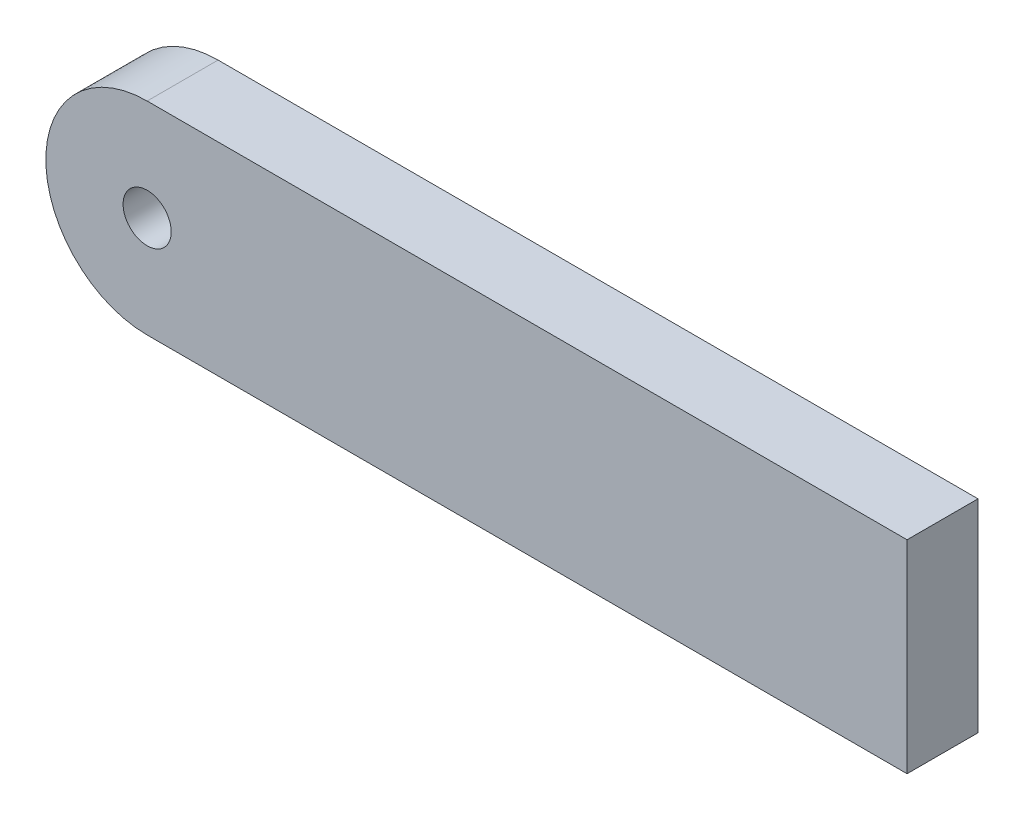
ISO-10303-21;
HEADER;
FILE_DESCRIPTION(('STEP AP214'),'2;1');
FILE_NAME('part.step','',(''),(''),'','','');
FILE_SCHEMA(('AUTOMOTIVE_DESIGN { 1 0 10303 214 1 1 1 1 }'));
ENDSEC;
DATA;
#1=APPLICATION_CONTEXT('core data for automotive mechanical design processes');
#2=APPLICATION_PROTOCOL_DEFINITION('international standard','automotive_design',2000,#1);
#3=PRODUCT_CONTEXT('',#1,'mechanical');
#4=PRODUCT('Part','Part','',(#3));
#5=PRODUCT_RELATED_PRODUCT_CATEGORY('part','',(#4));
#6=PRODUCT_DEFINITION_FORMATION('','',#4);
#7=PRODUCT_DEFINITION_CONTEXT('part definition',#1,'design');
#8=PRODUCT_DEFINITION('design','',#6,#7);
#9=PRODUCT_DEFINITION_SHAPE('','',#8);
#10=(LENGTH_UNIT() NAMED_UNIT(*) SI_UNIT(.MILLI.,.METRE.));
#11=(NAMED_UNIT(*) PLANE_ANGLE_UNIT() SI_UNIT($,.RADIAN.));
#12=(NAMED_UNIT(*) SI_UNIT($,.STERADIAN.) SOLID_ANGLE_UNIT());
#13=UNCERTAINTY_MEASURE_WITH_UNIT(LENGTH_MEASURE(1.E-05),#10,'distance_accuracy_value','');
#14=(GEOMETRIC_REPRESENTATION_CONTEXT(3) GLOBAL_UNCERTAINTY_ASSIGNED_CONTEXT((#13)) GLOBAL_UNIT_ASSIGNED_CONTEXT((#10,
#11,#12)) REPRESENTATION_CONTEXT('',''));
#15=CARTESIAN_POINT('',(0.,0.,0.));
#16=DIRECTION('',(0.,0.,1.));
#17=DIRECTION('',(1.,0.,0.));
#18=AXIS2_PLACEMENT_3D('',#15,#16,#17);
#19=CARTESIAN_POINT('',(0.,0.,28.));
#20=DIRECTION('',(0.,1.,0.));
#21=DIRECTION('',(0.,0.,1.));
#22=AXIS2_PLACEMENT_3D('',#19,#20,#21);
#23=PLANE('',#22);
#24=DIRECTION('',(1.,0.,0.));
#25=VECTOR('',#24,1.);
#26=CARTESIAN_POINT('',(0.,0.,0.));
#27=LINE('',#26,#25);
#28=CARTESIAN_POINT('',(0.,0.,0.));
#29=VERTEX_POINT('',#28);
#30=CARTESIAN_POINT('',(300.,0.,0.));
#31=VERTEX_POINT('',#30);
#32=EDGE_CURVE('E66',#29,#31,#27,.T.);
#33=ORIENTED_EDGE('',*,*,#32,.T.);
#34=DIRECTION('',(0.,0.,-1.));
#35=VECTOR('',#34,1.);
#36=CARTESIAN_POINT('',(300.,0.,28.));
#37=LINE('',#36,#35);
#38=CARTESIAN_POINT('',(300.,0.,28.));
#39=VERTEX_POINT('',#38);
#40=EDGE_CURVE('E45',#39,#31,#37,.T.);
#41=ORIENTED_EDGE('',*,*,#40,.F.);
#42=DIRECTION('',(1.,0.,0.));
#43=VECTOR('',#42,1.);
#44=CARTESIAN_POINT('',(0.,0.,28.));
#45=LINE('',#44,#43);
#46=CARTESIAN_POINT('',(0.,0.,28.));
#47=VERTEX_POINT('',#46);
#48=EDGE_CURVE('E78',#47,#39,#45,.T.);
#49=ORIENTED_EDGE('',*,*,#48,.F.);
#50=DIRECTION('',(0.,0.,-1.));
#51=VECTOR('',#50,1.);
#52=CARTESIAN_POINT('',(0.,0.,28.));
#53=LINE('',#52,#51);
#54=EDGE_CURVE('E11',#47,#29,#53,.T.);
#55=ORIENTED_EDGE('',*,*,#54,.T.);
#56=EDGE_LOOP('',(#33,#41,#49,#55));
#57=FACE_BOUND('',#56,.T.);
#58=ADVANCED_FACE('F37',(#57),#23,.F.);
#59=CARTESIAN_POINT('',(300.,0.,28.));
#60=DIRECTION('',(-1.,0.,0.));
#61=DIRECTION('',(0.,0.,1.));
#62=AXIS2_PLACEMENT_3D('',#59,#60,#61);
#63=PLANE('',#62);
#64=DIRECTION('',(0.,1.,0.));
#65=VECTOR('',#64,1.);
#66=CARTESIAN_POINT('',(300.,0.,0.));
#67=LINE('',#66,#65);
#68=CARTESIAN_POINT('',(300.,80.,0.));
#69=VERTEX_POINT('',#68);
#70=EDGE_CURVE('E73',#31,#69,#67,.T.);
#71=ORIENTED_EDGE('',*,*,#70,.T.);
#72=DIRECTION('',(0.,0.,-1.));
#73=VECTOR('',#72,1.);
#74=CARTESIAN_POINT('',(300.,80.,28.));
#75=LINE('',#74,#73);
#76=CARTESIAN_POINT('',(300.,80.,28.));
#77=VERTEX_POINT('',#76);
#78=EDGE_CURVE('E89',#77,#69,#75,.T.);
#79=ORIENTED_EDGE('',*,*,#78,.F.);
#80=DIRECTION('',(0.,1.,0.));
#81=VECTOR('',#80,1.);
#82=CARTESIAN_POINT('',(300.,0.,28.));
#83=LINE('',#82,#81);
#84=EDGE_CURVE('E109',#39,#77,#83,.T.);
#85=ORIENTED_EDGE('',*,*,#84,.F.);
#86=ORIENTED_EDGE('',*,*,#40,.T.);
#87=EDGE_LOOP('',(#71,#79,#85,#86));
#88=FACE_BOUND('',#87,.T.);
#89=ADVANCED_FACE('F114',(#88),#63,.F.);
#90=CARTESIAN_POINT('',(0.,80.,28.));
#91=DIRECTION('',(0.,-1.,0.));
#92=DIRECTION('',(0.,0.,-1.));
#93=AXIS2_PLACEMENT_3D('',#90,#91,#92);
#94=PLANE('',#93);
#95=DIRECTION('',(-1.,0.,0.));
#96=VECTOR('',#95,1.);
#97=CARTESIAN_POINT('',(0.,80.,0.));
#98=LINE('',#97,#96);
#99=CARTESIAN_POINT('',(0.,80.,0.));
#100=VERTEX_POINT('',#99);
#101=EDGE_CURVE('E84',#69,#100,#98,.T.);
#102=ORIENTED_EDGE('',*,*,#101,.T.);
#103=DIRECTION('',(0.,0.,-1.));
#104=VECTOR('',#103,1.);
#105=CARTESIAN_POINT('',(0.,80.,28.));
#106=LINE('',#105,#104);
#107=CARTESIAN_POINT('',(0.,80.,28.));
#108=VERTEX_POINT('',#107);
#109=EDGE_CURVE('E87',#108,#100,#106,.T.);
#110=ORIENTED_EDGE('',*,*,#109,.F.);
#111=DIRECTION('',(-1.,0.,0.));
#112=VECTOR('',#111,1.);
#113=CARTESIAN_POINT('',(0.,80.,28.));
#114=LINE('',#113,#112);
#115=EDGE_CURVE('E53',#77,#108,#114,.T.);
#116=ORIENTED_EDGE('',*,*,#115,.F.);
#117=ORIENTED_EDGE('',*,*,#78,.T.);
#118=EDGE_LOOP('',(#102,#110,#116,#117));
#119=FACE_BOUND('',#118,.T.);
#120=ADVANCED_FACE('F86',(#119),#94,.F.);
#121=CARTESIAN_POINT('',(0.,0.,28.));
#122=DIRECTION('',(0.,0.,-1.));
#123=DIRECTION('',(-1.,0.,0.));
#124=AXIS2_PLACEMENT_3D('',#121,#122,#123);
#125=PLANE('',#124);
#126=CARTESIAN_POINT('',(0.,40.,28.));
#127=DIRECTION('',(0.,0.,1.));
#128=DIRECTION('',(1.,0.,0.));
#129=AXIS2_PLACEMENT_3D('',#126,#127,#128);
#130=CIRCLE('',#129,9.5);
#131=CARTESIAN_POINT('',(9.49999999999993,40.,28.));
#132=VERTEX_POINT('',#131);
#133=EDGE_CURVE('E105',#132,#132,#130,.T.);
#134=ORIENTED_EDGE('',*,*,#133,.F.);
#135=EDGE_LOOP('',(#134));
#136=FACE_BOUND('',#135,.T.);
#137=ORIENTED_EDGE('',*,*,#115,.T.);
#138=CARTESIAN_POINT('',(0.,40.,28.));
#139=DIRECTION('',(0.,0.,1.));
#140=DIRECTION('',(1.,0.,0.));
#141=AXIS2_PLACEMENT_3D('',#138,#139,#140);
#142=CIRCLE('',#141,40.);
#143=EDGE_CURVE('E97',#108,#47,#142,.T.);
#144=ORIENTED_EDGE('',*,*,#143,.T.);
#145=ORIENTED_EDGE('',*,*,#48,.T.);
#146=ORIENTED_EDGE('',*,*,#84,.T.);
#147=EDGE_LOOP('',(#137,#144,#145,#146));
#148=FACE_BOUND('',#147,.T.);
#149=ADVANCED_FACE('F122',(#136,#148),#125,.F.);
#150=CARTESIAN_POINT('',(0.,0.,0.));
#151=DIRECTION('',(0.,0.,-1.));
#152=DIRECTION('',(-1.,0.,0.));
#153=AXIS2_PLACEMENT_3D('',#150,#151,#152);
#154=PLANE('',#153);
#155=CARTESIAN_POINT('',(0.,40.,0.));
#156=DIRECTION('',(0.,0.,1.));
#157=DIRECTION('',(1.,0.,0.));
#158=AXIS2_PLACEMENT_3D('',#155,#156,#157);
#159=CIRCLE('',#158,9.5);
#160=CARTESIAN_POINT('',(9.49999999999993,40.,0.));
#161=VERTEX_POINT('',#160);
#162=EDGE_CURVE('E102',#161,#161,#159,.T.);
#163=ORIENTED_EDGE('',*,*,#162,.T.);
#164=EDGE_LOOP('',(#163));
#165=FACE_BOUND('',#164,.T.);
#166=ORIENTED_EDGE('',*,*,#32,.F.);
#167=CARTESIAN_POINT('',(0.,40.,0.));
#168=DIRECTION('',(0.,0.,1.));
#169=DIRECTION('',(1.,0.,0.));
#170=AXIS2_PLACEMENT_3D('',#167,#168,#169);
#171=CIRCLE('',#170,40.);
#172=EDGE_CURVE('E96',#100,#29,#171,.T.);
#173=ORIENTED_EDGE('',*,*,#172,.F.);
#174=ORIENTED_EDGE('',*,*,#101,.F.);
#175=ORIENTED_EDGE('',*,*,#70,.F.);
#176=EDGE_LOOP('',(#166,#173,#174,#175));
#177=FACE_BOUND('',#176,.T.);
#178=ADVANCED_FACE('F99',(#165,#177),#154,.T.);
#179=CARTESIAN_POINT('',(0.,40.,0.));
#180=DIRECTION('',(0.,0.,1.));
#181=DIRECTION('',(1.,0.,0.));
#182=AXIS2_PLACEMENT_3D('',#179,#180,#181);
#183=CYLINDRICAL_SURFACE('',#182,40.);
#184=ORIENTED_EDGE('',*,*,#172,.T.);
#185=ORIENTED_EDGE('',*,*,#54,.F.);
#186=ORIENTED_EDGE('',*,*,#143,.F.);
#187=ORIENTED_EDGE('',*,*,#109,.T.);
#188=EDGE_LOOP('',(#184,#185,#186,#187));
#189=FACE_BOUND('',#188,.T.);
#190=ADVANCED_FACE('F95',(#189),#183,.T.);
#191=CARTESIAN_POINT('',(0.,40.,0.));
#192=DIRECTION('',(0.,0.,1.));
#193=DIRECTION('',(1.,0.,0.));
#194=AXIS2_PLACEMENT_3D('',#191,#192,#193);
#195=CYLINDRICAL_SURFACE('',#194,9.5);
#196=ORIENTED_EDGE('',*,*,#162,.F.);
#197=EDGE_LOOP('',(#196));
#198=FACE_BOUND('',#197,.T.);
#199=ORIENTED_EDGE('',*,*,#133,.T.);
#200=EDGE_LOOP('',(#199));
#201=FACE_BOUND('',#200,.T.);
#202=ADVANCED_FACE('F133',(#198,#201),#195,.F.);
#203=CLOSED_SHELL('',(#58,#89,#120,#149,#178,#190,#202));
#204=MANIFOLD_SOLID_BREP('B2',#203);
#205=ADVANCED_BREP_SHAPE_REPRESENTATION('',(#18,#204),#14);
#206=SHAPE_DEFINITION_REPRESENTATION(#9,#205);
ENDSEC;
END-ISO-10303-21;
